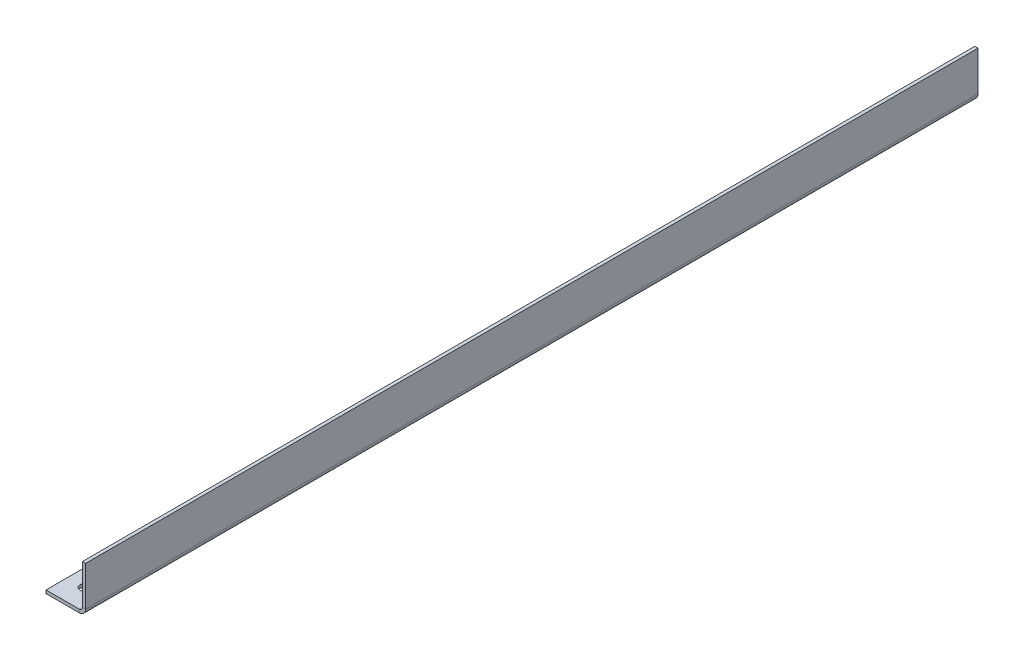
ISO-10303-21;
HEADER;
FILE_DESCRIPTION(('STEP AP214'),'2;1');
FILE_NAME('part.step','',(''),(''),'','','');
FILE_SCHEMA(('AUTOMOTIVE_DESIGN { 1 0 10303 214 1 1 1 1 }'));
ENDSEC;
DATA;
#1=APPLICATION_CONTEXT('core data for automotive mechanical design processes');
#2=APPLICATION_PROTOCOL_DEFINITION('international standard','automotive_design',2000,#1);
#3=PRODUCT_CONTEXT('',#1,'mechanical');
#4=PRODUCT('Part','Part','',(#3));
#5=PRODUCT_RELATED_PRODUCT_CATEGORY('part','',(#4));
#6=PRODUCT_DEFINITION_FORMATION('','',#4);
#7=PRODUCT_DEFINITION_CONTEXT('part definition',#1,'design');
#8=PRODUCT_DEFINITION('design','',#6,#7);
#9=PRODUCT_DEFINITION_SHAPE('','',#8);
#10=(LENGTH_UNIT() NAMED_UNIT(*) SI_UNIT(.MILLI.,.METRE.));
#11=(NAMED_UNIT(*) PLANE_ANGLE_UNIT() SI_UNIT($,.RADIAN.));
#12=(NAMED_UNIT(*) SI_UNIT($,.STERADIAN.) SOLID_ANGLE_UNIT());
#13=UNCERTAINTY_MEASURE_WITH_UNIT(LENGTH_MEASURE(1.E-05),#10,'distance_accuracy_value','');
#14=(GEOMETRIC_REPRESENTATION_CONTEXT(3) GLOBAL_UNCERTAINTY_ASSIGNED_CONTEXT((#13)) GLOBAL_UNIT_ASSIGNED_CONTEXT((#10,
#11,#12)) REPRESENTATION_CONTEXT('',''));
#15=CARTESIAN_POINT('',(0.,0.,0.));
#16=DIRECTION('',(0.,0.,1.));
#17=DIRECTION('',(1.,0.,0.));
#18=AXIS2_PLACEMENT_3D('',#15,#16,#17);
#19=CARTESIAN_POINT('',(65.,1.5,208.));
#20=DIRECTION('',(0.,0.,1.));
#21=DIRECTION('',(1.,0.,0.));
#22=AXIS2_PLACEMENT_3D('',#19,#20,#21);
#23=PLANE('',#22);
#24=DIRECTION('',(1.,0.,0.));
#25=VECTOR('',#24,1.);
#26=CARTESIAN_POINT('',(65.,1.5,208.));
#27=LINE('',#26,#25);
#28=CARTESIAN_POINT('',(65.,1.5,208.));
#29=VERTEX_POINT('',#28);
#30=CARTESIAN_POINT('',(66.5,1.5,208.));
#31=VERTEX_POINT('',#30);
#32=EDGE_CURVE('E11',#29,#31,#27,.T.);
#33=ORIENTED_EDGE('',*,*,#32,.F.);
#34=CARTESIAN_POINT('',(63.5,1.5,208.));
#35=DIRECTION('',(0.,0.,-1.));
#36=DIRECTION('',(-1.,0.,0.));
#37=AXIS2_PLACEMENT_3D('',#34,#35,#36);
#38=CIRCLE('',#37,1.5);
#39=CARTESIAN_POINT('',(63.5,0.,208.));
#40=VERTEX_POINT('',#39);
#41=EDGE_CURVE('E157',#40,#29,#38,.F.);
#42=ORIENTED_EDGE('',*,*,#41,.F.);
#43=DIRECTION('',(0.,1.,0.));
#44=VECTOR('',#43,1.);
#45=CARTESIAN_POINT('',(63.5,-1.5,208.));
#46=LINE('',#45,#44);
#47=CARTESIAN_POINT('',(63.5,-1.5,208.));
#48=VERTEX_POINT('',#47);
#49=EDGE_CURVE('E49',#48,#40,#46,.T.);
#50=ORIENTED_EDGE('',*,*,#49,.F.);
#51=CARTESIAN_POINT('',(63.5,1.5,208.));
#52=DIRECTION('',(0.,0.,1.));
#53=DIRECTION('',(1.,0.,0.));
#54=AXIS2_PLACEMENT_3D('',#51,#52,#53);
#55=CIRCLE('',#54,3.);
#56=EDGE_CURVE('E171',#48,#31,#55,.T.);
#57=ORIENTED_EDGE('',*,*,#56,.T.);
#58=EDGE_LOOP('',(#33,#42,#50,#57));
#59=FACE_BOUND('',#58,.T.);
#60=ADVANCED_FACE('F43',(#59),#23,.T.);
#61=CARTESIAN_POINT('',(63.5,-1.5,208.));
#62=DIRECTION('',(0.,0.,1.));
#63=DIRECTION('',(1.,0.,0.));
#64=AXIS2_PLACEMENT_3D('',#61,#62,#63);
#65=PLANE('',#64);
#66=DIRECTION('',(0.,1.,0.));
#67=VECTOR('',#66,1.);
#68=CARTESIAN_POINT('',(65.,0.,208.));
#69=LINE('',#68,#67);
#70=CARTESIAN_POINT('',(65.,20.,208.));
#71=VERTEX_POINT('',#70);
#72=EDGE_CURVE('E160',#29,#71,#69,.T.);
#73=ORIENTED_EDGE('',*,*,#72,.F.);
#74=ORIENTED_EDGE('',*,*,#32,.T.);
#75=DIRECTION('',(0.,1.,0.));
#76=VECTOR('',#75,1.);
#77=CARTESIAN_POINT('',(66.5,0.,208.));
#78=LINE('',#77,#76);
#79=CARTESIAN_POINT('',(66.5,20.,208.));
#80=VERTEX_POINT('',#79);
#81=EDGE_CURVE('E155',#31,#80,#78,.T.);
#82=ORIENTED_EDGE('',*,*,#81,.T.);
#83=DIRECTION('',(1.,0.,0.));
#84=VECTOR('',#83,1.);
#85=CARTESIAN_POINT('',(65.,20.,208.));
#86=LINE('',#85,#84);
#87=EDGE_CURVE('E109',#71,#80,#86,.T.);
#88=ORIENTED_EDGE('',*,*,#87,.F.);
#89=EDGE_LOOP('',(#73,#74,#82,#88));
#90=FACE_BOUND('',#89,.T.);
#91=ADVANCED_FACE('F216',(#90),#65,.T.);
#92=CARTESIAN_POINT('',(63.5,0.,-208.0001));
#93=DIRECTION('',(0.,0.,-1.));
#94=DIRECTION('',(-1.,0.,0.));
#95=AXIS2_PLACEMENT_3D('',#92,#93,#94);
#96=PLANE('',#95);
#97=DIRECTION('',(0.,-1.,0.));
#98=VECTOR('',#97,1.);
#99=CARTESIAN_POINT('',(63.5,0.,-208.0001));
#100=LINE('',#99,#98);
#101=CARTESIAN_POINT('',(63.5,0.,-208.0001));
#102=VERTEX_POINT('',#101);
#103=CARTESIAN_POINT('',(63.5,-1.5,-208.0001));
#104=VERTEX_POINT('',#103);
#105=EDGE_CURVE('E187',#102,#104,#100,.T.);
#106=ORIENTED_EDGE('',*,*,#105,.F.);
#107=CARTESIAN_POINT('',(63.5,1.5,-208.0001));
#108=DIRECTION('',(0.,0.,-1.));
#109=DIRECTION('',(-1.,0.,0.));
#110=AXIS2_PLACEMENT_3D('',#107,#108,#109);
#111=CIRCLE('',#110,1.5);
#112=CARTESIAN_POINT('',(65.,1.5,-208.0001));
#113=VERTEX_POINT('',#112);
#114=EDGE_CURVE('E138',#102,#113,#111,.F.);
#115=ORIENTED_EDGE('',*,*,#114,.T.);
#116=DIRECTION('',(-1.,0.,0.));
#117=VECTOR('',#116,1.);
#118=CARTESIAN_POINT('',(66.5,1.5,-208.0001));
#119=LINE('',#118,#117);
#120=CARTESIAN_POINT('',(66.5,1.5,-208.0001));
#121=VERTEX_POINT('',#120);
#122=EDGE_CURVE('E113',#121,#113,#119,.T.);
#123=ORIENTED_EDGE('',*,*,#122,.F.);
#124=CARTESIAN_POINT('',(63.5,1.5,-208.0001));
#125=DIRECTION('',(0.,0.,1.));
#126=DIRECTION('',(1.,0.,0.));
#127=AXIS2_PLACEMENT_3D('',#124,#125,#126);
#128=CIRCLE('',#127,3.);
#129=EDGE_CURVE('E152',#104,#121,#128,.T.);
#130=ORIENTED_EDGE('',*,*,#129,.F.);
#131=EDGE_LOOP('',(#106,#115,#123,#130));
#132=FACE_BOUND('',#131,.T.);
#133=ADVANCED_FACE('F214',(#132),#96,.T.);
#134=CARTESIAN_POINT('',(66.5,1.5,-208.0001));
#135=DIRECTION('',(0.,0.,-1.));
#136=DIRECTION('',(-1.,0.,0.));
#137=AXIS2_PLACEMENT_3D('',#134,#135,#136);
#138=PLANE('',#137);
#139=DIRECTION('',(1.,0.,0.));
#140=VECTOR('',#139,1.);
#141=CARTESIAN_POINT('',(48.,0.,-208.0001));
#142=LINE('',#141,#140);
#143=CARTESIAN_POINT('',(48.,0.,-208.0001));
#144=VERTEX_POINT('',#143);
#145=EDGE_CURVE('E143',#144,#102,#142,.T.);
#146=ORIENTED_EDGE('',*,*,#145,.T.);
#147=ORIENTED_EDGE('',*,*,#105,.T.);
#148=DIRECTION('',(1.,0.,0.));
#149=VECTOR('',#148,1.);
#150=CARTESIAN_POINT('',(48.,-1.5,-208.0001));
#151=LINE('',#150,#149);
#152=CARTESIAN_POINT('',(48.,-1.5,-208.0001));
#153=VERTEX_POINT('',#152);
#154=EDGE_CURVE('E146',#153,#104,#151,.T.);
#155=ORIENTED_EDGE('',*,*,#154,.F.);
#156=DIRECTION('',(0.,1.,0.));
#157=VECTOR('',#156,1.);
#158=CARTESIAN_POINT('',(48.,-1.5,-208.0001));
#159=LINE('',#158,#157);
#160=EDGE_CURVE('E147',#153,#144,#159,.T.);
#161=ORIENTED_EDGE('',*,*,#160,.T.);
#162=EDGE_LOOP('',(#146,#147,#155,#161));
#163=FACE_BOUND('',#162,.T.);
#164=ADVANCED_FACE('F206',(#163),#138,.T.);
#165=CARTESIAN_POINT('',(66.5,0.,208.));
#166=DIRECTION('',(-1.,0.,0.));
#167=DIRECTION('',(0.,0.,1.));
#168=AXIS2_PLACEMENT_3D('',#165,#166,#167);
#169=PLANE('',#168);
#170=DIRECTION('',(0.,0.,-1.));
#171=VECTOR('',#170,1.);
#172=CARTESIAN_POINT('',(66.5,1.5,208.));
#173=LINE('',#172,#171);
#174=EDGE_CURVE('E127',#31,#121,#173,.T.);
#175=ORIENTED_EDGE('',*,*,#174,.T.);
#176=DIRECTION('',(0.,1.,0.));
#177=VECTOR('',#176,1.);
#178=CARTESIAN_POINT('',(66.5,0.,-208.0001));
#179=LINE('',#178,#177);
#180=CARTESIAN_POINT('',(66.5,20.,-208.0001));
#181=VERTEX_POINT('',#180);
#182=EDGE_CURVE('E122',#121,#181,#179,.T.);
#183=ORIENTED_EDGE('',*,*,#182,.T.);
#184=DIRECTION('',(0.,0.,-1.));
#185=VECTOR('',#184,1.);
#186=CARTESIAN_POINT('',(66.5,20.,208.));
#187=LINE('',#186,#185);
#188=EDGE_CURVE('E104',#80,#181,#187,.T.);
#189=ORIENTED_EDGE('',*,*,#188,.F.);
#190=ORIENTED_EDGE('',*,*,#81,.F.);
#191=EDGE_LOOP('',(#175,#183,#189,#190));
#192=FACE_BOUND('',#191,.T.);
#193=ADVANCED_FACE('F130',(#192),#169,.F.);
#194=CARTESIAN_POINT('',(65.,20.,208.));
#195=DIRECTION('',(0.,1.,0.));
#196=DIRECTION('',(0.,0.,1.));
#197=AXIS2_PLACEMENT_3D('',#194,#195,#196);
#198=PLANE('',#197);
#199=ORIENTED_EDGE('',*,*,#188,.T.);
#200=DIRECTION('',(1.,0.,0.));
#201=VECTOR('',#200,1.);
#202=CARTESIAN_POINT('',(65.,20.,-208.0001));
#203=LINE('',#202,#201);
#204=CARTESIAN_POINT('',(65.,20.,-208.0001));
#205=VERTEX_POINT('',#204);
#206=EDGE_CURVE('E108',#205,#181,#203,.T.);
#207=ORIENTED_EDGE('',*,*,#206,.F.);
#208=DIRECTION('',(0.,0.,-1.));
#209=VECTOR('',#208,1.);
#210=CARTESIAN_POINT('',(65.,20.,208.));
#211=LINE('',#210,#209);
#212=EDGE_CURVE('E114',#71,#205,#211,.T.);
#213=ORIENTED_EDGE('',*,*,#212,.F.);
#214=ORIENTED_EDGE('',*,*,#87,.T.);
#215=EDGE_LOOP('',(#199,#207,#213,#214));
#216=FACE_BOUND('',#215,.T.);
#217=ADVANCED_FACE('F110',(#216),#198,.T.);
#218=CARTESIAN_POINT('',(65.,0.,208.));
#219=DIRECTION('',(-1.,0.,0.));
#220=DIRECTION('',(0.,0.,1.));
#221=AXIS2_PLACEMENT_3D('',#218,#219,#220);
#222=PLANE('',#221);
#223=ORIENTED_EDGE('',*,*,#212,.T.);
#224=DIRECTION('',(0.,1.,0.));
#225=VECTOR('',#224,1.);
#226=CARTESIAN_POINT('',(65.,0.,-208.0001));
#227=LINE('',#226,#225);
#228=EDGE_CURVE('E121',#113,#205,#227,.T.);
#229=ORIENTED_EDGE('',*,*,#228,.F.);
#230=DIRECTION('',(0.,0.,-1.));
#231=VECTOR('',#230,1.);
#232=CARTESIAN_POINT('',(65.,1.5,208.));
#233=LINE('',#232,#231);
#234=EDGE_CURVE('E181',#29,#113,#233,.T.);
#235=ORIENTED_EDGE('',*,*,#234,.F.);
#236=ORIENTED_EDGE('',*,*,#72,.T.);
#237=EDGE_LOOP('',(#223,#229,#235,#236));
#238=FACE_BOUND('',#237,.T.);
#239=ADVANCED_FACE('F217',(#238),#222,.T.);
#240=CARTESIAN_POINT('',(63.5,1.5,208.));
#241=DIRECTION('',(0.,0.,-1.));
#242=DIRECTION('',(-1.,0.,0.));
#243=AXIS2_PLACEMENT_3D('',#240,#241,#242);
#244=CYLINDRICAL_SURFACE('',#243,1.5);
#245=ORIENTED_EDGE('',*,*,#234,.T.);
#246=ORIENTED_EDGE('',*,*,#114,.F.);
#247=DIRECTION('',(0.,0.,-1.));
#248=VECTOR('',#247,1.);
#249=CARTESIAN_POINT('',(63.5,0.,208.));
#250=LINE('',#249,#248);
#251=EDGE_CURVE('E182',#40,#102,#250,.T.);
#252=ORIENTED_EDGE('',*,*,#251,.F.);
#253=ORIENTED_EDGE('',*,*,#41,.T.);
#254=EDGE_LOOP('',(#245,#246,#252,#253));
#255=FACE_BOUND('',#254,.T.);
#256=ADVANCED_FACE('F199',(#255),#244,.F.);
#257=CARTESIAN_POINT('',(48.,0.,208.));
#258=DIRECTION('',(0.,1.,0.));
#259=DIRECTION('',(0.,0.,1.));
#260=AXIS2_PLACEMENT_3D('',#257,#258,#259);
#261=PLANE('',#260);
#262=CARTESIAN_POINT('',(56.,0.,198.));
#263=DIRECTION('',(0.,1.,0.));
#264=DIRECTION('',(0.,0.,1.));
#265=AXIS2_PLACEMENT_3D('',#262,#263,#264);
#266=CIRCLE('',#265,2.15);
#267=CARTESIAN_POINT('',(56.,0.,200.15));
#268=VERTEX_POINT('',#267);
#269=EDGE_CURVE('E133',#268,#268,#266,.T.);
#270=ORIENTED_EDGE('',*,*,#269,.F.);
#271=EDGE_LOOP('',(#270));
#272=FACE_BOUND('',#271,.T.);
#273=CARTESIAN_POINT('',(56.,0.,-198.));
#274=DIRECTION('',(0.,1.,0.));
#275=DIRECTION('',(0.,0.,1.));
#276=AXIS2_PLACEMENT_3D('',#273,#274,#275);
#277=CIRCLE('',#276,2.15);
#278=CARTESIAN_POINT('',(56.,0.,-195.85));
#279=VERTEX_POINT('',#278);
#280=EDGE_CURVE('E350',#279,#279,#277,.T.);
#281=ORIENTED_EDGE('',*,*,#280,.F.);
#282=EDGE_LOOP('',(#281));
#283=FACE_BOUND('',#282,.T.);
#284=ORIENTED_EDGE('',*,*,#251,.T.);
#285=ORIENTED_EDGE('',*,*,#145,.F.);
#286=DIRECTION('',(0.,0.,-1.));
#287=VECTOR('',#286,1.);
#288=CARTESIAN_POINT('',(48.,0.,208.));
#289=LINE('',#288,#287);
#290=CARTESIAN_POINT('',(48.,0.,208.));
#291=VERTEX_POINT('',#290);
#292=EDGE_CURVE('E176',#291,#144,#289,.T.);
#293=ORIENTED_EDGE('',*,*,#292,.F.);
#294=DIRECTION('',(1.,0.,0.));
#295=VECTOR('',#294,1.);
#296=CARTESIAN_POINT('',(48.,0.,208.));
#297=LINE('',#296,#295);
#298=EDGE_CURVE('E163',#291,#40,#297,.T.);
#299=ORIENTED_EDGE('',*,*,#298,.T.);
#300=EDGE_LOOP('',(#284,#285,#293,#299));
#301=FACE_BOUND('',#300,.T.);
#302=ADVANCED_FACE('F203',(#272,#283,#301),#261,.T.);
#303=CARTESIAN_POINT('',(48.,-1.5,208.));
#304=DIRECTION('',(-1.,0.,0.));
#305=DIRECTION('',(0.,0.,1.));
#306=AXIS2_PLACEMENT_3D('',#303,#304,#305);
#307=PLANE('',#306);
#308=ORIENTED_EDGE('',*,*,#292,.T.);
#309=ORIENTED_EDGE('',*,*,#160,.F.);
#310=DIRECTION('',(0.,0.,-1.));
#311=VECTOR('',#310,1.);
#312=CARTESIAN_POINT('',(48.,-1.5,208.));
#313=LINE('',#312,#311);
#314=CARTESIAN_POINT('',(48.,-1.5,208.));
#315=VERTEX_POINT('',#314);
#316=EDGE_CURVE('E180',#315,#153,#313,.T.);
#317=ORIENTED_EDGE('',*,*,#316,.F.);
#318=DIRECTION('',(0.,1.,0.));
#319=VECTOR('',#318,1.);
#320=CARTESIAN_POINT('',(48.,-1.5,208.));
#321=LINE('',#320,#319);
#322=EDGE_CURVE('E166',#315,#291,#321,.T.);
#323=ORIENTED_EDGE('',*,*,#322,.T.);
#324=EDGE_LOOP('',(#308,#309,#317,#323));
#325=FACE_BOUND('',#324,.T.);
#326=ADVANCED_FACE('F207',(#325),#307,.T.);
#327=CARTESIAN_POINT('',(48.,-1.5,208.));
#328=DIRECTION('',(0.,1.,0.));
#329=DIRECTION('',(0.,0.,1.));
#330=AXIS2_PLACEMENT_3D('',#327,#328,#329);
#331=PLANE('',#330);
#332=CARTESIAN_POINT('',(56.,-1.5,198.));
#333=DIRECTION('',(0.,1.,0.));
#334=DIRECTION('',(0.,0.,1.));
#335=AXIS2_PLACEMENT_3D('',#332,#333,#334);
#336=CIRCLE('',#335,2.15);
#337=CARTESIAN_POINT('',(56.,-1.5,200.15));
#338=VERTEX_POINT('',#337);
#339=EDGE_CURVE('E129',#338,#338,#336,.T.);
#340=ORIENTED_EDGE('',*,*,#339,.T.);
#341=EDGE_LOOP('',(#340));
#342=FACE_BOUND('',#341,.T.);
#343=CARTESIAN_POINT('',(56.,-1.5,-198.));
#344=DIRECTION('',(0.,1.,0.));
#345=DIRECTION('',(0.,0.,1.));
#346=AXIS2_PLACEMENT_3D('',#343,#344,#345);
#347=CIRCLE('',#346,2.15);
#348=CARTESIAN_POINT('',(56.,-1.5,-195.85));
#349=VERTEX_POINT('',#348);
#350=EDGE_CURVE('E137',#349,#349,#347,.T.);
#351=ORIENTED_EDGE('',*,*,#350,.T.);
#352=EDGE_LOOP('',(#351));
#353=FACE_BOUND('',#352,.T.);
#354=ORIENTED_EDGE('',*,*,#316,.T.);
#355=ORIENTED_EDGE('',*,*,#154,.T.);
#356=DIRECTION('',(0.,0.,-1.));
#357=VECTOR('',#356,1.);
#358=CARTESIAN_POINT('',(63.5,-1.5,208.));
#359=LINE('',#358,#357);
#360=EDGE_CURVE('E173',#48,#104,#359,.T.);
#361=ORIENTED_EDGE('',*,*,#360,.F.);
#362=DIRECTION('',(1.,0.,0.));
#363=VECTOR('',#362,1.);
#364=CARTESIAN_POINT('',(48.,-1.5,208.));
#365=LINE('',#364,#363);
#366=EDGE_CURVE('E167',#315,#48,#365,.T.);
#367=ORIENTED_EDGE('',*,*,#366,.F.);
#368=EDGE_LOOP('',(#354,#355,#361,#367));
#369=FACE_BOUND('',#368,.T.);
#370=ADVANCED_FACE('F212',(#342,#353,#369),#331,.F.);
#371=CARTESIAN_POINT('',(63.5,1.5,208.));
#372=DIRECTION('',(0.,0.,-1.));
#373=DIRECTION('',(-1.,0.,0.));
#374=AXIS2_PLACEMENT_3D('',#371,#372,#373);
#375=CYLINDRICAL_SURFACE('',#374,3.);
#376=ORIENTED_EDGE('',*,*,#360,.T.);
#377=ORIENTED_EDGE('',*,*,#129,.T.);
#378=ORIENTED_EDGE('',*,*,#174,.F.);
#379=ORIENTED_EDGE('',*,*,#56,.F.);
#380=EDGE_LOOP('',(#376,#377,#378,#379));
#381=FACE_BOUND('',#380,.T.);
#382=ADVANCED_FACE('F220',(#381),#375,.T.);
#383=CARTESIAN_POINT('',(63.5,1.5,208.));
#384=DIRECTION('',(0.,0.,-1.));
#385=DIRECTION('',(-1.,0.,0.));
#386=AXIS2_PLACEMENT_3D('',#383,#384,#385);
#387=PLANE('',#386);
#388=ORIENTED_EDGE('',*,*,#366,.T.);
#389=ORIENTED_EDGE('',*,*,#49,.T.);
#390=ORIENTED_EDGE('',*,*,#298,.F.);
#391=ORIENTED_EDGE('',*,*,#322,.F.);
#392=EDGE_LOOP('',(#388,#389,#390,#391));
#393=FACE_BOUND('',#392,.T.);
#394=ADVANCED_FACE('F193',(#393),#387,.F.);
#395=CARTESIAN_POINT('',(63.5,1.5,-208.0001));
#396=DIRECTION('',(0.,0.,-1.));
#397=DIRECTION('',(-1.,0.,0.));
#398=AXIS2_PLACEMENT_3D('',#395,#396,#397);
#399=PLANE('',#398);
#400=ORIENTED_EDGE('',*,*,#182,.F.);
#401=ORIENTED_EDGE('',*,*,#122,.T.);
#402=ORIENTED_EDGE('',*,*,#228,.T.);
#403=ORIENTED_EDGE('',*,*,#206,.T.);
#404=EDGE_LOOP('',(#400,#401,#402,#403));
#405=FACE_BOUND('',#404,.T.);
#406=ADVANCED_FACE('F118',(#405),#399,.T.);
#407=CARTESIAN_POINT('',(56.,-1.5,-198.));
#408=DIRECTION('',(0.,1.,0.));
#409=DIRECTION('',(0.,0.,1.));
#410=AXIS2_PLACEMENT_3D('',#407,#408,#409);
#411=CYLINDRICAL_SURFACE('',#410,2.15);
#412=ORIENTED_EDGE('',*,*,#350,.F.);
#413=EDGE_LOOP('',(#412));
#414=FACE_BOUND('',#413,.T.);
#415=ORIENTED_EDGE('',*,*,#280,.T.);
#416=EDGE_LOOP('',(#415));
#417=FACE_BOUND('',#416,.T.);
#418=ADVANCED_FACE('F322',(#414,#417),#411,.F.);
#419=CARTESIAN_POINT('',(56.,-1.5,198.));
#420=DIRECTION('',(0.,1.,0.));
#421=DIRECTION('',(0.,0.,1.));
#422=AXIS2_PLACEMENT_3D('',#419,#420,#421);
#423=CYLINDRICAL_SURFACE('',#422,2.15);
#424=ORIENTED_EDGE('',*,*,#339,.F.);
#425=EDGE_LOOP('',(#424));
#426=FACE_BOUND('',#425,.T.);
#427=ORIENTED_EDGE('',*,*,#269,.T.);
#428=EDGE_LOOP('',(#427));
#429=FACE_BOUND('',#428,.T.);
#430=ADVANCED_FACE('F328',(#426,#429),#423,.F.);
#431=CLOSED_SHELL('',(#60,#91,#133,#164,#193,#217,#239,#256,#302,#326,#370,#382,#394,#406,#418,#430));
#432=MANIFOLD_SOLID_BREP('B2',#431);
#433=ADVANCED_BREP_SHAPE_REPRESENTATION('',(#18,#432),#14);
#434=SHAPE_DEFINITION_REPRESENTATION(#9,#433);
ENDSEC;
END-ISO-10303-21;
